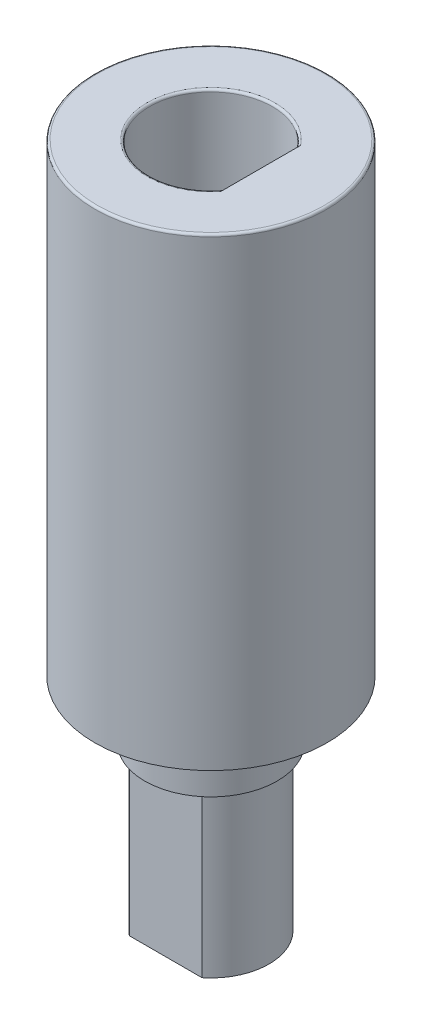
ISO-10303-21;
HEADER;
FILE_DESCRIPTION(('STEP AP214'),'2;1');
FILE_NAME('part.step','',(''),(''),'','','');
FILE_SCHEMA(('AUTOMOTIVE_DESIGN { 1 0 10303 214 1 1 1 1 }'));
ENDSEC;
DATA;
#1=APPLICATION_CONTEXT('core data for automotive mechanical design processes');
#2=APPLICATION_PROTOCOL_DEFINITION('international standard','automotive_design',2000,#1);
#3=PRODUCT_CONTEXT('',#1,'mechanical');
#4=PRODUCT('Part','Part','',(#3));
#5=PRODUCT_RELATED_PRODUCT_CATEGORY('part','',(#4));
#6=PRODUCT_DEFINITION_FORMATION('','',#4);
#7=PRODUCT_DEFINITION_CONTEXT('part definition',#1,'design');
#8=PRODUCT_DEFINITION('design','',#6,#7);
#9=PRODUCT_DEFINITION_SHAPE('','',#8);
#10=(LENGTH_UNIT() NAMED_UNIT(*) SI_UNIT(.MILLI.,.METRE.));
#11=(NAMED_UNIT(*) PLANE_ANGLE_UNIT() SI_UNIT($,.RADIAN.));
#12=(NAMED_UNIT(*) SI_UNIT($,.STERADIAN.) SOLID_ANGLE_UNIT());
#13=UNCERTAINTY_MEASURE_WITH_UNIT(LENGTH_MEASURE(1.E-05),#10,'distance_accuracy_value','');
#14=(GEOMETRIC_REPRESENTATION_CONTEXT(3) GLOBAL_UNCERTAINTY_ASSIGNED_CONTEXT((#13)) GLOBAL_UNIT_ASSIGNED_CONTEXT((#10,
#11,#12)) REPRESENTATION_CONTEXT('',''));
#15=CARTESIAN_POINT('',(0.,0.,0.));
#16=DIRECTION('',(0.,0.,1.));
#17=DIRECTION('',(1.,0.,0.));
#18=AXIS2_PLACEMENT_3D('',#15,#16,#17);
#19=CARTESIAN_POINT('',(0.,0.,0.));
#20=DIRECTION('',(0.,1.,0.));
#21=DIRECTION('',(0.,0.,1.));
#22=AXIS2_PLACEMENT_3D('',#19,#20,#21);
#23=PLANE('',#22);
#24=CARTESIAN_POINT('',(0.,0.,0.));
#25=DIRECTION('',(0.,1.,0.));
#26=DIRECTION('',(0.,0.,1.));
#27=AXIS2_PLACEMENT_3D('',#24,#25,#26);
#28=CIRCLE('',#27,2.85);
#29=CARTESIAN_POINT('',(0.,0.,2.85));
#30=VERTEX_POINT('',#29);
#31=EDGE_CURVE('E122',#30,#30,#28,.F.);
#32=ORIENTED_EDGE('',*,*,#31,.F.);
#33=EDGE_LOOP('',(#32));
#34=FACE_BOUND('',#33,.T.);
#35=CARTESIAN_POINT('',(0.,0.,0.));
#36=DIRECTION('',(0.,1.,0.));
#37=DIRECTION('',(0.,0.,1.));
#38=AXIS2_PLACEMENT_3D('',#35,#36,#37);
#39=CIRCLE('',#38,5.);
#40=CARTESIAN_POINT('',(0.,0.,5.));
#41=VERTEX_POINT('',#40);
#42=EDGE_CURVE('E125',#41,#41,#39,.T.);
#43=ORIENTED_EDGE('',*,*,#42,.F.);
#44=EDGE_LOOP('',(#43));
#45=FACE_BOUND('',#44,.T.);
#46=ADVANCED_FACE('F44',(#34,#45),#23,.F.);
#47=CARTESIAN_POINT('',(0.,20.,0.));
#48=DIRECTION('',(0.,-1.,0.));
#49=DIRECTION('',(0.,0.,-1.));
#50=AXIS2_PLACEMENT_3D('',#47,#48,#49);
#51=CYLINDRICAL_SURFACE('',#50,5.);
#52=CARTESIAN_POINT('',(0.,19.9,0.));
#53=DIRECTION('',(0.,1.,0.));
#54=DIRECTION('',(0.,0.,1.));
#55=AXIS2_PLACEMENT_3D('',#52,#53,#54);
#56=CIRCLE('',#55,5.);
#57=CARTESIAN_POINT('',(0.,19.9,5.));
#58=VERTEX_POINT('',#57);
#59=EDGE_CURVE('E183',#58,#58,#56,.F.);
#60=ORIENTED_EDGE('',*,*,#59,.T.);
#61=EDGE_LOOP('',(#60));
#62=FACE_BOUND('',#61,.T.);
#63=ORIENTED_EDGE('',*,*,#42,.T.);
#64=EDGE_LOOP('',(#63));
#65=FACE_BOUND('',#64,.T.);
#66=ADVANCED_FACE('F208',(#62,#65),#51,.T.);
#67=CARTESIAN_POINT('',(0.,20.,0.));
#68=DIRECTION('',(0.,1.,0.));
#69=DIRECTION('',(0.,0.,1.));
#70=AXIS2_PLACEMENT_3D('',#67,#68,#69);
#71=PLANE('',#70);
#72=CARTESIAN_POINT('',(0.,20.,0.));
#73=DIRECTION('',(0.,1.,0.));
#74=DIRECTION('',(0.,0.,1.));
#75=AXIS2_PLACEMENT_3D('',#72,#73,#74);
#76=CIRCLE('',#75,4.9);
#77=CARTESIAN_POINT('',(0.,20.,4.9));
#78=VERTEX_POINT('',#77);
#79=EDGE_CURVE('E179',#78,#78,#76,.T.);
#80=ORIENTED_EDGE('',*,*,#79,.T.);
#81=EDGE_LOOP('',(#80));
#82=FACE_BOUND('',#81,.T.);
#83=DIRECTION('',(0.,0.,-1.));
#84=VECTOR('',#83,1.);
#85=CARTESIAN_POINT('',(2.15,20.,-1.54919333848297));
#86=LINE('',#85,#84);
#87=CARTESIAN_POINT('',(2.15,20.,1.71464281994823));
#88=VERTEX_POINT('',#87);
#89=CARTESIAN_POINT('',(2.15,20.,-1.71464281994823));
#90=VERTEX_POINT('',#89);
#91=EDGE_CURVE('E152',#88,#90,#86,.T.);
#92=ORIENTED_EDGE('',*,*,#91,.F.);
#93=CARTESIAN_POINT('',(0.,20.,0.));
#94=DIRECTION('',(0.,1.,0.));
#95=DIRECTION('',(0.,0.,1.));
#96=AXIS2_PLACEMENT_3D('',#93,#94,#95);
#97=CIRCLE('',#96,2.75);
#98=EDGE_CURVE('E176',#88,#90,#97,.F.);
#99=ORIENTED_EDGE('',*,*,#98,.T.);
#100=EDGE_LOOP('',(#92,#99));
#101=FACE_BOUND('',#100,.T.);
#102=ADVANCED_FACE('F207',(#82,#101),#71,.T.);
#103=CARTESIAN_POINT('',(0.,5.,0.));
#104=DIRECTION('',(0.,1.,0.));
#105=DIRECTION('',(0.,0.,1.));
#106=AXIS2_PLACEMENT_3D('',#103,#104,#105);
#107=CYLINDRICAL_SURFACE('',#106,2.65);
#108=DIRECTION('',(0.,1.,0.));
#109=VECTOR('',#108,1.);
#110=CARTESIAN_POINT('',(2.15,5.,-1.54919333848297));
#111=LINE('',#110,#109);
#112=CARTESIAN_POINT('',(2.15,5.,-1.54919333848297));
#113=VERTEX_POINT('',#112);
#114=CARTESIAN_POINT('',(2.15,19.9,-1.54919333848297));
#115=VERTEX_POINT('',#114);
#116=EDGE_CURVE('E165',#113,#115,#111,.T.);
#117=ORIENTED_EDGE('',*,*,#116,.T.);
#118=CARTESIAN_POINT('',(0.,19.9,0.));
#119=DIRECTION('',(0.,1.,0.));
#120=DIRECTION('',(0.,0.,1.));
#121=AXIS2_PLACEMENT_3D('',#118,#119,#120);
#122=CIRCLE('',#121,2.65);
#123=CARTESIAN_POINT('',(2.15,19.9,1.54919333848297));
#124=VERTEX_POINT('',#123);
#125=EDGE_CURVE('E189',#115,#124,#122,.T.);
#126=ORIENTED_EDGE('',*,*,#125,.T.);
#127=DIRECTION('',(0.,1.,0.));
#128=VECTOR('',#127,1.);
#129=CARTESIAN_POINT('',(2.15,5.,1.54919333848297));
#130=LINE('',#129,#128);
#131=CARTESIAN_POINT('',(2.15,5.,1.54919333848297));
#132=VERTEX_POINT('',#131);
#133=EDGE_CURVE('E163',#132,#124,#130,.T.);
#134=ORIENTED_EDGE('',*,*,#133,.F.);
#135=CARTESIAN_POINT('',(0.,5.,0.));
#136=DIRECTION('',(0.,1.,0.));
#137=DIRECTION('',(0.,0.,1.));
#138=AXIS2_PLACEMENT_3D('',#135,#136,#137);
#139=CIRCLE('',#138,2.65);
#140=EDGE_CURVE('E154',#113,#132,#139,.T.);
#141=ORIENTED_EDGE('',*,*,#140,.F.);
#142=EDGE_LOOP('',(#117,#126,#134,#141));
#143=FACE_BOUND('',#142,.T.);
#144=ADVANCED_FACE('F201',(#143),#107,.F.);
#145=CARTESIAN_POINT('',(2.15,5.,-1.54919333848297));
#146=DIRECTION('',(1.,0.,0.));
#147=DIRECTION('',(0.,0.,-1.));
#148=AXIS2_PLACEMENT_3D('',#145,#146,#147);
#149=PLANE('',#148);
#150=ORIENTED_EDGE('',*,*,#91,.T.);
#151=CARTESIAN_POINT('',(2.15,20.,-1.71464281994823));
#152=CARTESIAN_POINT('',(2.15,19.999997296109,-1.70747534618));
#153=CARTESIAN_POINT('',(2.15,19.9997007612507,-1.70031474088193));
#154=CARTESIAN_POINT('',(2.15,19.9985127511079,-1.68602807429301));
#155=CARTESIAN_POINT('',(2.15,19.9976200305507,-1.67890211681886));
#156=CARTESIAN_POINT('',(2.15,19.9940159023904,-1.65751883684628));
#157=CARTESIAN_POINT('',(2.15,19.9903782188444,-1.64339330136425));
#158=CARTESIAN_POINT('',(2.15,19.9826803304898,-1.62252000755946));
#159=CARTESIAN_POINT('',(2.15,19.9796057362052,-1.61539978506114));
#160=CARTESIAN_POINT('',(2.15,19.9725657213655,-1.60162081066677));
#161=CARTESIAN_POINT('',(2.15,19.9686026982423,-1.59496087880039));
#162=CARTESIAN_POINT('',(2.15,19.9608125317072,-1.58400688685223));
#163=CARTESIAN_POINT('',(2.15,19.9572183367943,-1.57954812650027));
#164=CARTESIAN_POINT('',(2.15,19.9493992215469,-1.57121381991281));
#165=CARTESIAN_POINT('',(2.15,19.945175204207,-1.5673374543995));
#166=CARTESIAN_POINT('',(2.15,19.9374426945584,-1.56149446639207));
#167=CARTESIAN_POINT('',(2.15,19.9341038021069,-1.55930474542208));
#168=CARTESIAN_POINT('',(2.15,19.927128380375,-1.55548178026339));
#169=CARTESIAN_POINT('',(2.15,19.9234928866854,-1.55384669469623));
#170=CARTESIAN_POINT('',(2.15,19.9165807371841,-1.55147096660644));
#171=CARTESIAN_POINT('',(2.15,19.9133391839027,-1.55062932767844));
#172=CARTESIAN_POINT('',(2.15,19.9067350322218,-1.54948466144092));
#173=CARTESIAN_POINT('',(2.15,19.9033716378329,-1.54918628411922));
#174=CARTESIAN_POINT('',(2.15,19.9,-1.54919333848297));
#175=B_SPLINE_CURVE_WITH_KNOTS('',3,(#151,#152,#153,#154,#155,#156,#157,#158,#159,#160,#161,
#162,#163,#164,#165,#166,#167,#168,#169,#170,#171,#172,#173,#174),.UNSPECIFIED.,.F.,.F.,(4,2,2,
2,2,2,2,2,2,2,2,4),(0.,0.0214824892543317,0.0430099906241302,0.0864720691216814,
0.109694834751489,0.132855672197372,0.149990159239062,0.167100312173423,0.179039089613214,
0.19093783346803,0.200940968493936,0.211029328817637),.UNSPECIFIED.);
#176=EDGE_CURVE('E11',#90,#115,#175,.T.);
#177=ORIENTED_EDGE('',*,*,#176,.T.);
#178=ORIENTED_EDGE('',*,*,#116,.F.);
#179=DIRECTION('',(0.,0.,-1.));
#180=VECTOR('',#179,1.);
#181=CARTESIAN_POINT('',(2.15,5.,-1.54919333848297));
#182=LINE('',#181,#180);
#183=EDGE_CURVE('E160',#132,#113,#182,.T.);
#184=ORIENTED_EDGE('',*,*,#183,.F.);
#185=ORIENTED_EDGE('',*,*,#133,.T.);
#186=CARTESIAN_POINT('',(2.15,19.9,1.54919333848297));
#187=CARTESIAN_POINT('',(2.15,19.9040909044543,1.54917948209307));
#188=CARTESIAN_POINT('',(2.15,19.9081631819167,1.54962182694883));
#189=CARTESIAN_POINT('',(2.15,19.9160918366815,1.55128927294745));
#190=CARTESIAN_POINT('',(2.15,19.9199503331284,1.55250411875561));
#191=CARTESIAN_POINT('',(2.15,19.9273662141427,1.55558471901743));
#192=CARTESIAN_POINT('',(2.15,19.9309250705555,1.557447029444));
#193=CARTESIAN_POINT('',(2.15,19.9377334262062,1.56168477240605));
#194=CARTESIAN_POINT('',(2.15,19.9409817857211,1.56406199805659));
#195=CARTESIAN_POINT('',(2.15,19.9489669334022,1.57071716713751));
#196=CARTESIAN_POINT('',(2.15,19.9534561429435,1.57529094626992));
#197=CARTESIAN_POINT('',(2.15,19.9616805463715,1.58506721311468));
#198=CARTESIAN_POINT('',(2.15,19.9654139979081,1.59027111039454));
#199=CARTESIAN_POINT('',(2.15,19.9743159351949,1.60443447705223));
#200=CARTESIAN_POINT('',(2.15,19.9789481843441,1.61372975798412));
#201=CARTESIAN_POINT('',(2.15,19.9867604517665,1.63291547961737));
#202=CARTESIAN_POINT('',(2.15,19.9899361721968,1.64280758544852));
#203=CARTESIAN_POINT('',(2.15,19.9950063908428,1.66299516830031));
#204=CARTESIAN_POINT('',(2.15,19.9968903837723,1.67329324879599));
#205=CARTESIAN_POINT('',(2.15,19.9993747221554,1.69394566000734));
#206=CARTESIAN_POINT('',(2.15,19.9999870296674,1.70429853954723));
#207=CARTESIAN_POINT('',(2.15,20.,1.71464281994823));
#208=B_SPLINE_CURVE_WITH_KNOTS('',3,(#186,#187,#188,#189,#190,#191,#192,#193,#194,#195,#196,
#197,#198,#199,#200,#201,#202,#203,#204,#205,#206,#207),.UNSPECIFIED.,.F.,.F.,(4,2,2,2,2,2,2,2,
2,2,4),(0.,0.0122193913745806,0.0242798576352094,0.036277128705745,0.0483168701282533,
0.0674342951089986,0.0865953043052509,0.117580883511148,0.148657314118977,0.179983575344801,
0.211013807539415),.UNSPECIFIED.);
#209=EDGE_CURVE('E58',#124,#88,#208,.T.);
#210=ORIENTED_EDGE('',*,*,#209,.T.);
#211=EDGE_LOOP('',(#150,#177,#178,#184,#185,#210));
#212=FACE_BOUND('',#211,.T.);
#213=ADVANCED_FACE('F195',(#212),#149,.F.);
#214=CARTESIAN_POINT('',(0.,5.,0.));
#215=DIRECTION('',(0.,1.,0.));
#216=DIRECTION('',(0.,0.,1.));
#217=AXIS2_PLACEMENT_3D('',#214,#215,#216);
#218=PLANE('',#217);
#219=ORIENTED_EDGE('',*,*,#140,.T.);
#220=ORIENTED_EDGE('',*,*,#183,.T.);
#221=EDGE_LOOP('',(#219,#220));
#222=FACE_BOUND('',#221,.T.);
#223=ADVANCED_FACE('F200',(#222),#218,.T.);
#224=CARTESIAN_POINT('',(0.,-2.5,0.));
#225=DIRECTION('',(0.,-1.,0.));
#226=DIRECTION('',(0.,0.,-1.));
#227=AXIS2_PLACEMENT_3D('',#224,#225,#226);
#228=PLANE('',#227);
#229=CARTESIAN_POINT('',(0.,-2.5,0.));
#230=DIRECTION('',(0.,-1.,0.));
#231=DIRECTION('',(0.,0.,-1.));
#232=AXIS2_PLACEMENT_3D('',#229,#230,#231);
#233=CIRCLE('',#232,2.85);
#234=CARTESIAN_POINT('',(0.,-2.5,-2.85));
#235=VERTEX_POINT('',#234);
#236=EDGE_CURVE('E135',#235,#235,#233,.T.);
#237=ORIENTED_EDGE('',*,*,#236,.T.);
#238=EDGE_LOOP('',(#237));
#239=FACE_BOUND('',#238,.T.);
#240=CARTESIAN_POINT('',(0.,-2.5,0.));
#241=DIRECTION('',(0.,-1.,0.));
#242=DIRECTION('',(0.,0.,-1.));
#243=AXIS2_PLACEMENT_3D('',#240,#241,#242);
#244=CIRCLE('',#243,2.5);
#245=CARTESIAN_POINT('',(1.5644487847162,-2.5,-1.95));
#246=VERTEX_POINT('',#245);
#247=CARTESIAN_POINT('',(1.5644487847162,-2.5,1.95));
#248=VERTEX_POINT('',#247);
#249=EDGE_CURVE('E114',#246,#248,#244,.T.);
#250=ORIENTED_EDGE('',*,*,#249,.F.);
#251=DIRECTION('',(1.,0.,0.));
#252=VECTOR('',#251,1.);
#253=CARTESIAN_POINT('',(-1.5644487847162,-2.5,-1.95));
#254=LINE('',#253,#252);
#255=CARTESIAN_POINT('',(-1.5644487847162,-2.5,-1.95));
#256=VERTEX_POINT('',#255);
#257=EDGE_CURVE('E107',#256,#246,#254,.T.);
#258=ORIENTED_EDGE('',*,*,#257,.F.);
#259=CARTESIAN_POINT('',(0.,-2.5,0.));
#260=DIRECTION('',(0.,-1.,0.));
#261=DIRECTION('',(0.,0.,-1.));
#262=AXIS2_PLACEMENT_3D('',#259,#260,#261);
#263=CIRCLE('',#262,2.5);
#264=CARTESIAN_POINT('',(-1.5644487847162,-2.5,1.95));
#265=VERTEX_POINT('',#264);
#266=EDGE_CURVE('E115',#265,#256,#263,.T.);
#267=ORIENTED_EDGE('',*,*,#266,.F.);
#268=DIRECTION('',(-1.,0.,0.));
#269=VECTOR('',#268,1.);
#270=CARTESIAN_POINT('',(-1.5644487847162,-2.5,1.95));
#271=LINE('',#270,#269);
#272=EDGE_CURVE('E133',#248,#265,#271,.T.);
#273=ORIENTED_EDGE('',*,*,#272,.F.);
#274=EDGE_LOOP('',(#250,#258,#267,#273));
#275=FACE_BOUND('',#274,.T.);
#276=ADVANCED_FACE('F111',(#239,#275),#228,.T.);
#277=CARTESIAN_POINT('',(0.,-2.5,0.));
#278=DIRECTION('',(0.,1.,0.));
#279=DIRECTION('',(0.,0.,1.));
#280=AXIS2_PLACEMENT_3D('',#277,#278,#279);
#281=CYLINDRICAL_SURFACE('',#280,2.85);
#282=ORIENTED_EDGE('',*,*,#236,.F.);
#283=EDGE_LOOP('',(#282));
#284=FACE_BOUND('',#283,.T.);
#285=ORIENTED_EDGE('',*,*,#31,.T.);
#286=EDGE_LOOP('',(#285));
#287=FACE_BOUND('',#286,.T.);
#288=ADVANCED_FACE('F237',(#284,#287),#281,.T.);
#289=CARTESIAN_POINT('',(0.,-9.5,0.));
#290=DIRECTION('',(0.,1.,0.));
#291=DIRECTION('',(0.,0.,1.));
#292=AXIS2_PLACEMENT_3D('',#289,#290,#291);
#293=PLANE('',#292);
#294=CARTESIAN_POINT('',(0.,-9.5,0.));
#295=DIRECTION('',(0.,-1.,0.));
#296=DIRECTION('',(0.,0.,1.));
#297=AXIS2_PLACEMENT_3D('',#294,#295,#296);
#298=CIRCLE('',#297,2.5);
#299=CARTESIAN_POINT('',(1.5644487847162,-9.5,-1.95));
#300=VERTEX_POINT('',#299);
#301=CARTESIAN_POINT('',(1.5644487847162,-9.5,1.95));
#302=VERTEX_POINT('',#301);
#303=EDGE_CURVE('E263',#300,#302,#298,.T.);
#304=ORIENTED_EDGE('',*,*,#303,.T.);
#305=DIRECTION('',(-1.,0.,0.));
#306=VECTOR('',#305,1.);
#307=CARTESIAN_POINT('',(-1.5644487847162,-9.5,1.95));
#308=LINE('',#307,#306);
#309=CARTESIAN_POINT('',(-1.5644487847162,-9.5,1.95));
#310=VERTEX_POINT('',#309);
#311=EDGE_CURVE('E261',#302,#310,#308,.T.);
#312=ORIENTED_EDGE('',*,*,#311,.T.);
#313=CARTESIAN_POINT('',(0.,-9.5,0.));
#314=DIRECTION('',(0.,-1.,0.));
#315=DIRECTION('',(0.,0.,-1.));
#316=AXIS2_PLACEMENT_3D('',#313,#314,#315);
#317=CIRCLE('',#316,2.5);
#318=CARTESIAN_POINT('',(-1.5644487847162,-9.5,-1.95));
#319=VERTEX_POINT('',#318);
#320=EDGE_CURVE('E274',#310,#319,#317,.T.);
#321=ORIENTED_EDGE('',*,*,#320,.T.);
#322=DIRECTION('',(1.,0.,0.));
#323=VECTOR('',#322,1.);
#324=CARTESIAN_POINT('',(-1.5644487847162,-9.5,-1.95));
#325=LINE('',#324,#323);
#326=EDGE_CURVE('E137',#319,#300,#325,.T.);
#327=ORIENTED_EDGE('',*,*,#326,.T.);
#328=EDGE_LOOP('',(#304,#312,#321,#327));
#329=FACE_BOUND('',#328,.T.);
#330=ADVANCED_FACE('F244',(#329),#293,.F.);
#331=CARTESIAN_POINT('',(-1.5644487847162,-9.5,-1.95));
#332=DIRECTION('',(0.,0.,1.));
#333=DIRECTION('',(1.,0.,0.));
#334=AXIS2_PLACEMENT_3D('',#331,#332,#333);
#335=PLANE('',#334);
#336=DIRECTION('',(0.,1.,0.));
#337=VECTOR('',#336,1.);
#338=CARTESIAN_POINT('',(-1.5644487847162,-9.5,-1.95));
#339=LINE('',#338,#337);
#340=EDGE_CURVE('E128',#319,#256,#339,.T.);
#341=ORIENTED_EDGE('',*,*,#340,.T.);
#342=ORIENTED_EDGE('',*,*,#257,.T.);
#343=DIRECTION('',(0.,1.,0.));
#344=VECTOR('',#343,1.);
#345=CARTESIAN_POINT('',(1.5644487847162,-9.5,-1.95));
#346=LINE('',#345,#344);
#347=EDGE_CURVE('E139',#300,#246,#346,.T.);
#348=ORIENTED_EDGE('',*,*,#347,.F.);
#349=ORIENTED_EDGE('',*,*,#326,.F.);
#350=EDGE_LOOP('',(#341,#342,#348,#349));
#351=FACE_BOUND('',#350,.T.);
#352=ADVANCED_FACE('F140',(#351),#335,.F.);
#353=CARTESIAN_POINT('',(0.,-9.5,0.));
#354=DIRECTION('',(0.,1.,0.));
#355=DIRECTION('',(0.,0.,1.));
#356=AXIS2_PLACEMENT_3D('',#353,#354,#355);
#357=CYLINDRICAL_SURFACE('',#356,2.5);
#358=DIRECTION('',(0.,1.,0.));
#359=VECTOR('',#358,1.);
#360=CARTESIAN_POINT('',(-1.5644487847162,-9.5,1.95));
#361=LINE('',#360,#359);
#362=EDGE_CURVE('E132',#310,#265,#361,.T.);
#363=ORIENTED_EDGE('',*,*,#362,.T.);
#364=ORIENTED_EDGE('',*,*,#266,.T.);
#365=ORIENTED_EDGE('',*,*,#340,.F.);
#366=ORIENTED_EDGE('',*,*,#320,.F.);
#367=EDGE_LOOP('',(#363,#364,#365,#366));
#368=FACE_BOUND('',#367,.T.);
#369=ADVANCED_FACE('F127',(#368),#357,.T.);
#370=CARTESIAN_POINT('',(-1.5644487847162,-9.5,1.95));
#371=DIRECTION('',(0.,0.,-1.));
#372=DIRECTION('',(-1.,0.,0.));
#373=AXIS2_PLACEMENT_3D('',#370,#371,#372);
#374=PLANE('',#373);
#375=DIRECTION('',(0.,1.,0.));
#376=VECTOR('',#375,1.);
#377=CARTESIAN_POINT('',(1.5644487847162,-9.5,1.95));
#378=LINE('',#377,#376);
#379=EDGE_CURVE('E144',#302,#248,#378,.T.);
#380=ORIENTED_EDGE('',*,*,#379,.T.);
#381=ORIENTED_EDGE('',*,*,#272,.T.);
#382=ORIENTED_EDGE('',*,*,#362,.F.);
#383=ORIENTED_EDGE('',*,*,#311,.F.);
#384=EDGE_LOOP('',(#380,#381,#382,#383));
#385=FACE_BOUND('',#384,.T.);
#386=ADVANCED_FACE('F224',(#385),#374,.F.);
#387=CARTESIAN_POINT('',(0.,-9.5,0.));
#388=DIRECTION('',(0.,1.,0.));
#389=DIRECTION('',(0.,0.,1.));
#390=AXIS2_PLACEMENT_3D('',#387,#388,#389);
#391=CYLINDRICAL_SURFACE('',#390,2.5);
#392=ORIENTED_EDGE('',*,*,#347,.T.);
#393=ORIENTED_EDGE('',*,*,#249,.T.);
#394=ORIENTED_EDGE('',*,*,#379,.F.);
#395=ORIENTED_EDGE('',*,*,#303,.F.);
#396=EDGE_LOOP('',(#392,#393,#394,#395));
#397=FACE_BOUND('',#396,.T.);
#398=ADVANCED_FACE('F218',(#397),#391,.T.);
#399=CARTESIAN_POINT('',(0.,19.9,0.));
#400=DIRECTION('',(0.,1.,0.));
#401=DIRECTION('',(0.,0.,1.));
#402=AXIS2_PLACEMENT_3D('',#399,#400,#401);
#403=TOROIDAL_SURFACE('',#402,4.9,0.1);
#404=ORIENTED_EDGE('',*,*,#59,.F.);
#405=EDGE_LOOP('',(#404));
#406=FACE_BOUND('',#405,.T.);
#407=ORIENTED_EDGE('',*,*,#79,.F.);
#408=EDGE_LOOP('',(#407));
#409=FACE_BOUND('',#408,.T.);
#410=ADVANCED_FACE('F217',(#406,#409),#403,.T.);
#411=CARTESIAN_POINT('',(0.,19.9,0.));
#412=DIRECTION('',(0.,1.,0.));
#413=DIRECTION('',(0.,0.,1.));
#414=AXIS2_PLACEMENT_3D('',#411,#412,#413);
#415=TOROIDAL_SURFACE('',#414,2.75,0.1);
#416=ORIENTED_EDGE('',*,*,#176,.F.);
#417=ORIENTED_EDGE('',*,*,#98,.F.);
#418=ORIENTED_EDGE('',*,*,#209,.F.);
#419=ORIENTED_EDGE('',*,*,#125,.F.);
#420=EDGE_LOOP('',(#416,#417,#418,#419));
#421=FACE_BOUND('',#420,.T.);
#422=ADVANCED_FACE('F50',(#421),#415,.T.);
#423=CLOSED_SHELL('',(#46,#66,#102,#144,#213,#223,#276,#288,#330,#352,#369,#386,#398,#410,#422));
#424=MANIFOLD_SOLID_BREP('B2',#423);
#425=ADVANCED_BREP_SHAPE_REPRESENTATION('',(#18,#424),#14);
#426=SHAPE_DEFINITION_REPRESENTATION(#9,#425);
ENDSEC;
END-ISO-10303-21;
